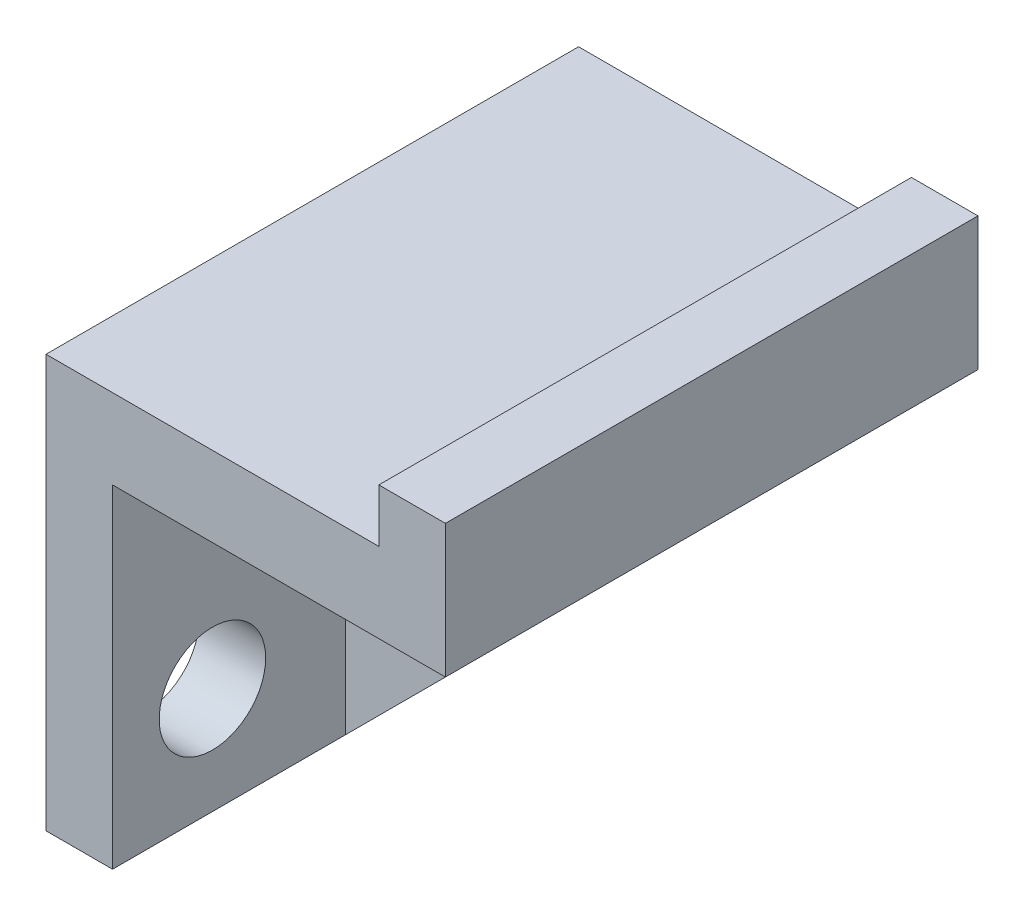
ISO-10303-21;
HEADER;
FILE_DESCRIPTION(('STEP AP214'),'2;1');
FILE_NAME('part.step','',(''),(''),'','','');
FILE_SCHEMA(('AUTOMOTIVE_DESIGN { 1 0 10303 214 1 1 1 1 }'));
ENDSEC;
DATA;
#1=APPLICATION_CONTEXT('core data for automotive mechanical design processes');
#2=APPLICATION_PROTOCOL_DEFINITION('international standard','automotive_design',2000,#1);
#3=PRODUCT_CONTEXT('',#1,'mechanical');
#4=PRODUCT('Part','Part','',(#3));
#5=PRODUCT_RELATED_PRODUCT_CATEGORY('part','',(#4));
#6=PRODUCT_DEFINITION_FORMATION('','',#4);
#7=PRODUCT_DEFINITION_CONTEXT('part definition',#1,'design');
#8=PRODUCT_DEFINITION('design','',#6,#7);
#9=PRODUCT_DEFINITION_SHAPE('','',#8);
#10=(LENGTH_UNIT() NAMED_UNIT(*) SI_UNIT(.MILLI.,.METRE.));
#11=(NAMED_UNIT(*) PLANE_ANGLE_UNIT() SI_UNIT($,.RADIAN.));
#12=(NAMED_UNIT(*) SI_UNIT($,.STERADIAN.) SOLID_ANGLE_UNIT());
#13=UNCERTAINTY_MEASURE_WITH_UNIT(LENGTH_MEASURE(1.E-05),#10,'distance_accuracy_value','');
#14=(GEOMETRIC_REPRESENTATION_CONTEXT(3) GLOBAL_UNCERTAINTY_ASSIGNED_CONTEXT((#13)) GLOBAL_UNIT_ASSIGNED_CONTEXT((#10,
#11,#12)) REPRESENTATION_CONTEXT('',''));
#15=CARTESIAN_POINT('',(0.,0.,0.));
#16=DIRECTION('',(0.,0.,1.));
#17=DIRECTION('',(1.,0.,0.));
#18=AXIS2_PLACEMENT_3D('',#15,#16,#17);
#19=CARTESIAN_POINT('',(10000.,0.,40000.));
#20=DIRECTION('',(-1.,0.,0.));
#21=DIRECTION('',(0.,0.,1.));
#22=AXIS2_PLACEMENT_3D('',#19,#20,#21);
#23=PLANE('',#22);
#24=CARTESIAN_POINT('',(10000.,16000.,-25000.));
#25=DIRECTION('',(1.,0.,0.));
#26=DIRECTION('',(0.,0.,-1.));
#27=AXIS2_PLACEMENT_3D('',#24,#25,#26);
#28=CIRCLE('',#27,8000.);
#29=CARTESIAN_POINT('',(10000.,16000.,-33000.));
#30=VERTEX_POINT('',#29);
#31=EDGE_CURVE('E219',#30,#30,#28,.T.);
#32=ORIENTED_EDGE('',*,*,#31,.F.);
#33=EDGE_LOOP('',(#32));
#34=FACE_BOUND('',#33,.T.);
#35=DIRECTION('',(0.,-1.,0.));
#36=VECTOR('',#35,1.);
#37=CARTESIAN_POINT('',(10000.,50000.,-5000.));
#38=LINE('',#37,#36);
#39=CARTESIAN_POINT('',(10000.,50000.,-5000.));
#40=VERTEX_POINT('',#39);
#41=CARTESIAN_POINT('',(10000.,0.,-5000.));
#42=VERTEX_POINT('',#41);
#43=EDGE_CURVE('E184',#40,#42,#38,.T.);
#44=ORIENTED_EDGE('',*,*,#43,.T.);
#45=DIRECTION('',(0.,0.,-1.));
#46=VECTOR('',#45,1.);
#47=CARTESIAN_POINT('',(10000.,0.,40000.));
#48=LINE('',#47,#46);
#49=CARTESIAN_POINT('',(10000.,0.,-40000.));
#50=VERTEX_POINT('',#49);
#51=EDGE_CURVE('E172',#42,#50,#48,.T.);
#52=ORIENTED_EDGE('',*,*,#51,.T.);
#53=DIRECTION('',(0.,1.,0.));
#54=VECTOR('',#53,1.);
#55=CARTESIAN_POINT('',(10000.,0.,-40000.));
#56=LINE('',#55,#54);
#57=CARTESIAN_POINT('',(10000.,50000.,-40000.));
#58=VERTEX_POINT('',#57);
#59=EDGE_CURVE('E149',#50,#58,#56,.T.);
#60=ORIENTED_EDGE('',*,*,#59,.T.);
#61=DIRECTION('',(0.,0.,-1.));
#62=VECTOR('',#61,1.);
#63=CARTESIAN_POINT('',(10000.,50000.,40000.));
#64=LINE('',#63,#62);
#65=EDGE_CURVE('E169',#40,#58,#64,.T.);
#66=ORIENTED_EDGE('',*,*,#65,.F.);
#67=EDGE_LOOP('',(#44,#52,#60,#66));
#68=FACE_BOUND('',#67,.T.);
#69=ADVANCED_FACE('F33',(#34,#68),#23,.F.);
#70=CARTESIAN_POINT('',(10000.,50000.,40000.));
#71=DIRECTION('',(0.,1.,0.));
#72=DIRECTION('',(0.,0.,1.));
#73=AXIS2_PLACEMENT_3D('',#70,#71,#72);
#74=PLANE('',#73);
#75=DIRECTION('',(-1.,0.,0.));
#76=VECTOR('',#75,1.);
#77=CARTESIAN_POINT('',(60000.,50000.,-5000.));
#78=LINE('',#77,#76);
#79=CARTESIAN_POINT('',(60000.,50000.,-5000.));
#80=VERTEX_POINT('',#79);
#81=EDGE_CURVE('E198',#80,#40,#78,.T.);
#82=ORIENTED_EDGE('',*,*,#81,.T.);
#83=ORIENTED_EDGE('',*,*,#65,.T.);
#84=DIRECTION('',(1.,0.,0.));
#85=VECTOR('',#84,1.);
#86=CARTESIAN_POINT('',(10000.,50000.,-40000.));
#87=LINE('',#86,#85);
#88=CARTESIAN_POINT('',(60000.,50000.,-40000.));
#89=VERTEX_POINT('',#88);
#90=EDGE_CURVE('E152',#58,#89,#87,.T.);
#91=ORIENTED_EDGE('',*,*,#90,.T.);
#92=DIRECTION('',(0.,0.,-1.));
#93=VECTOR('',#92,1.);
#94=CARTESIAN_POINT('',(60000.,50000.,40000.));
#95=LINE('',#94,#93);
#96=EDGE_CURVE('E165',#80,#89,#95,.T.);
#97=ORIENTED_EDGE('',*,*,#96,.F.);
#98=EDGE_LOOP('',(#82,#83,#91,#97));
#99=FACE_BOUND('',#98,.T.);
#100=ADVANCED_FACE('F195',(#99),#74,.F.);
#101=CARTESIAN_POINT('',(-3.5527136788005E-12,62000.,40000.));
#102=DIRECTION('',(1.,0.,0.));
#103=DIRECTION('',(0.,1.,0.));
#104=AXIS2_PLACEMENT_3D('',#101,#102,#103);
#105=PLANE('',#104);
#106=CARTESIAN_POINT('',(-3.5527136788005E-12,16000.,-25000.));
#107=DIRECTION('',(1.,0.,0.));
#108=DIRECTION('',(0.,0.,-1.));
#109=AXIS2_PLACEMENT_3D('',#106,#107,#108);
#110=CIRCLE('',#109,8000.);
#111=CARTESIAN_POINT('',(-3.5527136788005E-12,16000.,-33000.));
#112=VERTEX_POINT('',#111);
#113=EDGE_CURVE('E239',#112,#112,#110,.T.);
#114=ORIENTED_EDGE('',*,*,#113,.T.);
#115=EDGE_LOOP('',(#114));
#116=FACE_BOUND('',#115,.T.);
#117=CARTESIAN_POINT('',(-3.5527136788005E-12,16000.,25000.));
#118=DIRECTION('',(1.,0.,0.));
#119=DIRECTION('',(0.,0.,-1.));
#120=AXIS2_PLACEMENT_3D('',#117,#118,#119);
#121=CIRCLE('',#120,8000.);
#122=CARTESIAN_POINT('',(-3.5527136788005E-12,16000.,17000.));
#123=VERTEX_POINT('',#122);
#124=EDGE_CURVE('E146',#123,#123,#121,.T.);
#125=ORIENTED_EDGE('',*,*,#124,.T.);
#126=EDGE_LOOP('',(#125));
#127=FACE_BOUND('',#126,.T.);
#128=DIRECTION('',(0.,-1.,0.));
#129=VECTOR('',#128,1.);
#130=CARTESIAN_POINT('',(-3.5527136788005E-12,62000.,-40000.));
#131=LINE('',#130,#129);
#132=CARTESIAN_POINT('',(-3.5527136788005E-12,62000.,-40000.));
#133=VERTEX_POINT('',#132);
#134=CARTESIAN_POINT('',(0.,0.,-40000.));
#135=VERTEX_POINT('',#134);
#136=EDGE_CURVE('E142',#133,#135,#131,.T.);
#137=ORIENTED_EDGE('',*,*,#136,.T.);
#138=DIRECTION('',(0.,0.,-1.));
#139=VECTOR('',#138,1.);
#140=CARTESIAN_POINT('',(0.,0.,40000.));
#141=LINE('',#140,#139);
#142=CARTESIAN_POINT('',(0.,0.,40000.));
#143=VERTEX_POINT('',#142);
#144=EDGE_CURVE('E11',#143,#135,#141,.T.);
#145=ORIENTED_EDGE('',*,*,#144,.F.);
#146=DIRECTION('',(0.,-1.,0.));
#147=VECTOR('',#146,1.);
#148=CARTESIAN_POINT('',(-3.5527136788005E-12,62000.,40000.));
#149=LINE('',#148,#147);
#150=CARTESIAN_POINT('',(-3.5527136788005E-12,62000.,40000.));
#151=VERTEX_POINT('',#150);
#152=EDGE_CURVE('E161',#151,#143,#149,.T.);
#153=ORIENTED_EDGE('',*,*,#152,.F.);
#154=DIRECTION('',(0.,0.,-1.));
#155=VECTOR('',#154,1.);
#156=CARTESIAN_POINT('',(-3.5527136788005E-12,62000.,40000.));
#157=LINE('',#156,#155);
#158=EDGE_CURVE('E138',#151,#133,#157,.T.);
#159=ORIENTED_EDGE('',*,*,#158,.T.);
#160=EDGE_LOOP('',(#137,#145,#153,#159));
#161=FACE_BOUND('',#160,.T.);
#162=ADVANCED_FACE('F35',(#116,#127,#161),#105,.F.);
#163=CARTESIAN_POINT('',(0.,0.,40000.));
#164=DIRECTION('',(0.,1.,0.));
#165=DIRECTION('',(0.,0.,1.));
#166=AXIS2_PLACEMENT_3D('',#163,#164,#165);
#167=PLANE('',#166);
#168=DIRECTION('',(1.,0.,0.));
#169=VECTOR('',#168,1.);
#170=CARTESIAN_POINT('',(0.,0.,-40000.));
#171=LINE('',#170,#169);
#172=EDGE_CURVE('E145',#135,#50,#171,.T.);
#173=ORIENTED_EDGE('',*,*,#172,.T.);
#174=ORIENTED_EDGE('',*,*,#51,.F.);
#175=DIRECTION('',(0.,0.,-1.));
#176=VECTOR('',#175,1.);
#177=CARTESIAN_POINT('',(10000.,0.,5000.));
#178=LINE('',#177,#176);
#179=CARTESIAN_POINT('',(10000.,0.,5000.));
#180=VERTEX_POINT('',#179);
#181=EDGE_CURVE('E220',#180,#42,#178,.T.);
#182=ORIENTED_EDGE('',*,*,#181,.F.);
#183=CARTESIAN_POINT('',(10000.,0.,40000.));
#184=VERTEX_POINT('',#183);
#185=EDGE_CURVE('E41',#184,#180,#48,.T.);
#186=ORIENTED_EDGE('',*,*,#185,.F.);
#187=DIRECTION('',(1.,0.,0.));
#188=VECTOR('',#187,1.);
#189=CARTESIAN_POINT('',(0.,0.,40000.));
#190=LINE('',#189,#188);
#191=EDGE_CURVE('E98',#143,#184,#190,.T.);
#192=ORIENTED_EDGE('',*,*,#191,.F.);
#193=ORIENTED_EDGE('',*,*,#144,.T.);
#194=EDGE_LOOP('',(#173,#174,#182,#186,#192,#193));
#195=FACE_BOUND('',#194,.T.);
#196=ADVANCED_FACE('F186',(#195),#167,.F.);
#197=CARTESIAN_POINT('',(10000.,16000.,25000.));
#198=DIRECTION('',(1.,0.,0.));
#199=DIRECTION('',(0.,0.,-1.));
#200=AXIS2_PLACEMENT_3D('',#197,#198,#199);
#201=CIRCLE('',#200,8000.);
#202=CARTESIAN_POINT('',(10000.,16000.,17000.));
#203=VERTEX_POINT('',#202);
#204=EDGE_CURVE('E236',#203,#203,#201,.T.);
#205=ORIENTED_EDGE('',*,*,#204,.F.);
#206=EDGE_LOOP('',(#205));
#207=FACE_BOUND('',#206,.T.);
#208=ORIENTED_EDGE('',*,*,#185,.T.);
#209=DIRECTION('',(0.,-1.,0.));
#210=VECTOR('',#209,1.);
#211=CARTESIAN_POINT('',(10000.,50000.,5000.));
#212=LINE('',#211,#210);
#213=CARTESIAN_POINT('',(10000.,50000.,5000.));
#214=VERTEX_POINT('',#213);
#215=EDGE_CURVE('E214',#214,#180,#212,.T.);
#216=ORIENTED_EDGE('',*,*,#215,.F.);
#217=CARTESIAN_POINT('',(10000.,50000.,40000.));
#218=VERTEX_POINT('',#217);
#219=EDGE_CURVE('E170',#218,#214,#64,.T.);
#220=ORIENTED_EDGE('',*,*,#219,.F.);
#221=DIRECTION('',(0.,1.,0.));
#222=VECTOR('',#221,1.);
#223=CARTESIAN_POINT('',(10000.,0.,40000.));
#224=LINE('',#223,#222);
#225=EDGE_CURVE('E230',#184,#218,#224,.T.);
#226=ORIENTED_EDGE('',*,*,#225,.F.);
#227=EDGE_LOOP('',(#208,#216,#220,#226));
#228=FACE_BOUND('',#227,.T.);
#229=ADVANCED_FACE('F261',(#207,#228),#23,.F.);
#230=ORIENTED_EDGE('',*,*,#219,.T.);
#231=DIRECTION('',(-1.,0.,0.));
#232=VECTOR('',#231,1.);
#233=CARTESIAN_POINT('',(60000.,50000.,5000.));
#234=LINE('',#233,#232);
#235=CARTESIAN_POINT('',(60000.,50000.,5000.));
#236=VERTEX_POINT('',#235);
#237=EDGE_CURVE('E213',#236,#214,#234,.T.);
#238=ORIENTED_EDGE('',*,*,#237,.F.);
#239=CARTESIAN_POINT('',(60000.,50000.,40000.));
#240=VERTEX_POINT('',#239);
#241=EDGE_CURVE('E166',#240,#236,#95,.T.);
#242=ORIENTED_EDGE('',*,*,#241,.F.);
#243=DIRECTION('',(1.,0.,0.));
#244=VECTOR('',#243,1.);
#245=CARTESIAN_POINT('',(10000.,50000.,40000.));
#246=LINE('',#245,#244);
#247=EDGE_CURVE('E229',#218,#240,#246,.T.);
#248=ORIENTED_EDGE('',*,*,#247,.F.);
#249=EDGE_LOOP('',(#230,#238,#242,#248));
#250=FACE_BOUND('',#249,.T.);
#251=ADVANCED_FACE('F224',(#250),#74,.F.);
#252=CARTESIAN_POINT('',(60000.,50000.,40000.));
#253=DIRECTION('',(-1.,0.,0.));
#254=DIRECTION('',(0.,0.,1.));
#255=AXIS2_PLACEMENT_3D('',#252,#253,#254);
#256=PLANE('',#255);
#257=DIRECTION('',(0.,1.,0.));
#258=VECTOR('',#257,1.);
#259=CARTESIAN_POINT('',(60000.,50000.,-40000.));
#260=LINE('',#259,#258);
#261=CARTESIAN_POINT('',(60000.,70000.,-40000.));
#262=VERTEX_POINT('',#261);
#263=EDGE_CURVE('E155',#89,#262,#260,.T.);
#264=ORIENTED_EDGE('',*,*,#263,.T.);
#265=DIRECTION('',(0.,0.,-1.));
#266=VECTOR('',#265,1.);
#267=CARTESIAN_POINT('',(60000.,70000.,40000.));
#268=LINE('',#267,#266);
#269=CARTESIAN_POINT('',(60000.,70000.,40000.));
#270=VERTEX_POINT('',#269);
#271=EDGE_CURVE('E133',#270,#262,#268,.T.);
#272=ORIENTED_EDGE('',*,*,#271,.F.);
#273=DIRECTION('',(0.,1.,0.));
#274=VECTOR('',#273,1.);
#275=CARTESIAN_POINT('',(60000.,50000.,40000.));
#276=LINE('',#275,#274);
#277=EDGE_CURVE('E121',#240,#270,#276,.T.);
#278=ORIENTED_EDGE('',*,*,#277,.F.);
#279=ORIENTED_EDGE('',*,*,#241,.T.);
#280=DIRECTION('',(0.,0.,-1.));
#281=VECTOR('',#280,1.);
#282=CARTESIAN_POINT('',(60000.,50000.,5000.));
#283=LINE('',#282,#281);
#284=EDGE_CURVE('E216',#236,#80,#283,.T.);
#285=ORIENTED_EDGE('',*,*,#284,.T.);
#286=ORIENTED_EDGE('',*,*,#96,.T.);
#287=EDGE_LOOP('',(#264,#272,#278,#279,#285,#286));
#288=FACE_BOUND('',#287,.T.);
#289=ADVANCED_FACE('F228',(#288),#256,.F.);
#290=CARTESIAN_POINT('',(60000.,70000.,40000.));
#291=DIRECTION('',(0.,-1.,0.));
#292=DIRECTION('',(1.,0.,0.));
#293=AXIS2_PLACEMENT_3D('',#290,#291,#292);
#294=PLANE('',#293);
#295=DIRECTION('',(-1.,0.,0.));
#296=VECTOR('',#295,1.);
#297=CARTESIAN_POINT('',(60000.,70000.,-40000.));
#298=LINE('',#297,#296);
#299=CARTESIAN_POINT('',(50000.,70000.,-40000.));
#300=VERTEX_POINT('',#299);
#301=EDGE_CURVE('E130',#262,#300,#298,.T.);
#302=ORIENTED_EDGE('',*,*,#301,.T.);
#303=DIRECTION('',(0.,0.,-1.));
#304=VECTOR('',#303,1.);
#305=CARTESIAN_POINT('',(50000.,70000.,40000.));
#306=LINE('',#305,#304);
#307=CARTESIAN_POINT('',(50000.,70000.,40000.));
#308=VERTEX_POINT('',#307);
#309=EDGE_CURVE('E127',#308,#300,#306,.T.);
#310=ORIENTED_EDGE('',*,*,#309,.F.);
#311=DIRECTION('',(-1.,0.,0.));
#312=VECTOR('',#311,1.);
#313=CARTESIAN_POINT('',(60000.,70000.,40000.));
#314=LINE('',#313,#312);
#315=EDGE_CURVE('E114',#270,#308,#314,.T.);
#316=ORIENTED_EDGE('',*,*,#315,.F.);
#317=ORIENTED_EDGE('',*,*,#271,.T.);
#318=EDGE_LOOP('',(#302,#310,#316,#317));
#319=FACE_BOUND('',#318,.T.);
#320=ADVANCED_FACE('F128',(#319),#294,.F.);
#321=CARTESIAN_POINT('',(50000.,70000.,40000.));
#322=DIRECTION('',(1.,0.,0.));
#323=DIRECTION('',(0.,1.,0.));
#324=AXIS2_PLACEMENT_3D('',#321,#322,#323);
#325=PLANE('',#324);
#326=DIRECTION('',(0.,-1.,0.));
#327=VECTOR('',#326,1.);
#328=CARTESIAN_POINT('',(50000.,70000.,-40000.));
#329=LINE('',#328,#327);
#330=CARTESIAN_POINT('',(50000.,62000.,-40000.));
#331=VERTEX_POINT('',#330);
#332=EDGE_CURVE('E158',#300,#331,#329,.T.);
#333=ORIENTED_EDGE('',*,*,#332,.T.);
#334=DIRECTION('',(0.,0.,-1.));
#335=VECTOR('',#334,1.);
#336=CARTESIAN_POINT('',(50000.,62000.,40000.));
#337=LINE('',#336,#335);
#338=CARTESIAN_POINT('',(50000.,62000.,40000.));
#339=VERTEX_POINT('',#338);
#340=EDGE_CURVE('E134',#339,#331,#337,.T.);
#341=ORIENTED_EDGE('',*,*,#340,.F.);
#342=DIRECTION('',(0.,-1.,0.));
#343=VECTOR('',#342,1.);
#344=CARTESIAN_POINT('',(50000.,70000.,40000.));
#345=LINE('',#344,#343);
#346=EDGE_CURVE('E118',#308,#339,#345,.T.);
#347=ORIENTED_EDGE('',*,*,#346,.F.);
#348=ORIENTED_EDGE('',*,*,#309,.T.);
#349=EDGE_LOOP('',(#333,#341,#347,#348));
#350=FACE_BOUND('',#349,.T.);
#351=ADVANCED_FACE('F136',(#350),#325,.F.);
#352=CARTESIAN_POINT('',(50000.,62000.,40000.));
#353=DIRECTION('',(0.,-1.,0.));
#354=DIRECTION('',(0.,0.,-1.));
#355=AXIS2_PLACEMENT_3D('',#352,#353,#354);
#356=PLANE('',#355);
#357=DIRECTION('',(-1.,0.,0.));
#358=VECTOR('',#357,1.);
#359=CARTESIAN_POINT('',(50000.,62000.,-40000.));
#360=LINE('',#359,#358);
#361=EDGE_CURVE('E90',#331,#133,#360,.T.);
#362=ORIENTED_EDGE('',*,*,#361,.T.);
#363=ORIENTED_EDGE('',*,*,#158,.F.);
#364=DIRECTION('',(-1.,0.,0.));
#365=VECTOR('',#364,1.);
#366=CARTESIAN_POINT('',(50000.,62000.,40000.));
#367=LINE('',#366,#365);
#368=EDGE_CURVE('E57',#339,#151,#367,.T.);
#369=ORIENTED_EDGE('',*,*,#368,.F.);
#370=ORIENTED_EDGE('',*,*,#340,.T.);
#371=EDGE_LOOP('',(#362,#363,#369,#370));
#372=FACE_BOUND('',#371,.T.);
#373=ADVANCED_FACE('F290',(#372),#356,.F.);
#374=CARTESIAN_POINT('',(0.,0.,40000.));
#375=DIRECTION('',(0.,0.,1.));
#376=DIRECTION('',(1.,0.,0.));
#377=AXIS2_PLACEMENT_3D('',#374,#375,#376);
#378=PLANE('',#377);
#379=ORIENTED_EDGE('',*,*,#152,.T.);
#380=ORIENTED_EDGE('',*,*,#191,.T.);
#381=ORIENTED_EDGE('',*,*,#225,.T.);
#382=ORIENTED_EDGE('',*,*,#247,.T.);
#383=ORIENTED_EDGE('',*,*,#277,.T.);
#384=ORIENTED_EDGE('',*,*,#315,.T.);
#385=ORIENTED_EDGE('',*,*,#346,.T.);
#386=ORIENTED_EDGE('',*,*,#368,.T.);
#387=EDGE_LOOP('',(#379,#380,#381,#382,#383,#384,#385,#386));
#388=FACE_BOUND('',#387,.T.);
#389=ADVANCED_FACE('F116',(#388),#378,.T.);
#390=CARTESIAN_POINT('',(0.,0.,-40000.));
#391=DIRECTION('',(0.,0.,1.));
#392=DIRECTION('',(1.,0.,0.));
#393=AXIS2_PLACEMENT_3D('',#390,#391,#392);
#394=PLANE('',#393);
#395=ORIENTED_EDGE('',*,*,#136,.F.);
#396=ORIENTED_EDGE('',*,*,#361,.F.);
#397=ORIENTED_EDGE('',*,*,#332,.F.);
#398=ORIENTED_EDGE('',*,*,#301,.F.);
#399=ORIENTED_EDGE('',*,*,#263,.F.);
#400=ORIENTED_EDGE('',*,*,#90,.F.);
#401=ORIENTED_EDGE('',*,*,#59,.F.);
#402=ORIENTED_EDGE('',*,*,#172,.F.);
#403=EDGE_LOOP('',(#395,#396,#397,#398,#399,#400,#401,#402));
#404=FACE_BOUND('',#403,.T.);
#405=ADVANCED_FACE('F190',(#404),#394,.F.);
#406=CARTESIAN_POINT('',(-3.5527136788005E-12,16000.,25000.));
#407=DIRECTION('',(1.,0.,0.));
#408=DIRECTION('',(0.,0.,-1.));
#409=AXIS2_PLACEMENT_3D('',#406,#407,#408);
#410=CYLINDRICAL_SURFACE('',#409,8000.);
#411=ORIENTED_EDGE('',*,*,#124,.F.);
#412=EDGE_LOOP('',(#411));
#413=FACE_BOUND('',#412,.T.);
#414=ORIENTED_EDGE('',*,*,#204,.T.);
#415=EDGE_LOOP('',(#414));
#416=FACE_BOUND('',#415,.T.);
#417=ADVANCED_FACE('F275',(#413,#416),#410,.F.);
#418=CARTESIAN_POINT('',(-3.5527136788005E-12,16000.,-25000.));
#419=DIRECTION('',(1.,0.,0.));
#420=DIRECTION('',(0.,0.,-1.));
#421=AXIS2_PLACEMENT_3D('',#418,#419,#420);
#422=CYLINDRICAL_SURFACE('',#421,8000.);
#423=ORIENTED_EDGE('',*,*,#113,.F.);
#424=EDGE_LOOP('',(#423));
#425=FACE_BOUND('',#424,.T.);
#426=ORIENTED_EDGE('',*,*,#31,.T.);
#427=EDGE_LOOP('',(#426));
#428=FACE_BOUND('',#427,.T.);
#429=ADVANCED_FACE('F277',(#425,#428),#422,.F.);
#430=CARTESIAN_POINT('',(10000.,0.,5000.));
#431=DIRECTION('',(-0.707106781186548,0.707106781186547,0.));
#432=DIRECTION('',(-0.707106781186547,-0.707106781186548,0.));
#433=AXIS2_PLACEMENT_3D('',#430,#431,#432);
#434=PLANE('',#433);
#435=DIRECTION('',(0.707106781186547,0.707106781186548,0.));
#436=VECTOR('',#435,1.);
#437=CARTESIAN_POINT('',(10000.,0.,-5000.));
#438=LINE('',#437,#436);
#439=EDGE_CURVE('E48',#42,#80,#438,.T.);
#440=ORIENTED_EDGE('',*,*,#439,.T.);
#441=ORIENTED_EDGE('',*,*,#284,.F.);
#442=DIRECTION('',(0.707106781186547,0.707106781186548,0.));
#443=VECTOR('',#442,1.);
#444=CARTESIAN_POINT('',(10000.,0.,5000.));
#445=LINE('',#444,#443);
#446=EDGE_CURVE('E210',#180,#236,#445,.T.);
#447=ORIENTED_EDGE('',*,*,#446,.F.);
#448=ORIENTED_EDGE('',*,*,#181,.T.);
#449=EDGE_LOOP('',(#440,#441,#447,#448));
#450=FACE_BOUND('',#449,.T.);
#451=ADVANCED_FACE('F217',(#450),#434,.F.);
#452=CARTESIAN_POINT('',(0.,0.,5000.));
#453=DIRECTION('',(0.,0.,1.));
#454=DIRECTION('',(1.,0.,0.));
#455=AXIS2_PLACEMENT_3D('',#452,#453,#454);
#456=PLANE('',#455);
#457=ORIENTED_EDGE('',*,*,#446,.T.);
#458=ORIENTED_EDGE('',*,*,#237,.T.);
#459=ORIENTED_EDGE('',*,*,#215,.T.);
#460=EDGE_LOOP('',(#457,#458,#459));
#461=FACE_BOUND('',#460,.T.);
#462=ADVANCED_FACE('F211',(#461),#456,.T.);
#463=CARTESIAN_POINT('',(0.,0.,-5000.));
#464=DIRECTION('',(0.,0.,1.));
#465=DIRECTION('',(1.,0.,0.));
#466=AXIS2_PLACEMENT_3D('',#463,#464,#465);
#467=PLANE('',#466);
#468=ORIENTED_EDGE('',*,*,#439,.F.);
#469=ORIENTED_EDGE('',*,*,#43,.F.);
#470=ORIENTED_EDGE('',*,*,#81,.F.);
#471=EDGE_LOOP('',(#468,#469,#470));
#472=FACE_BOUND('',#471,.T.);
#473=ADVANCED_FACE('F250',(#472),#467,.F.);
#474=CLOSED_SHELL('',(#69,#100,#162,#196,#229,#251,#289,#320,#351,#373,#389,#405,#417,#429,#451,
#462,#473));
#475=MANIFOLD_SOLID_BREP('B2',#474);
#476=ADVANCED_BREP_SHAPE_REPRESENTATION('',(#18,#475),#14);
#477=SHAPE_DEFINITION_REPRESENTATION(#9,#476);
ENDSEC;
END-ISO-10303-21;
